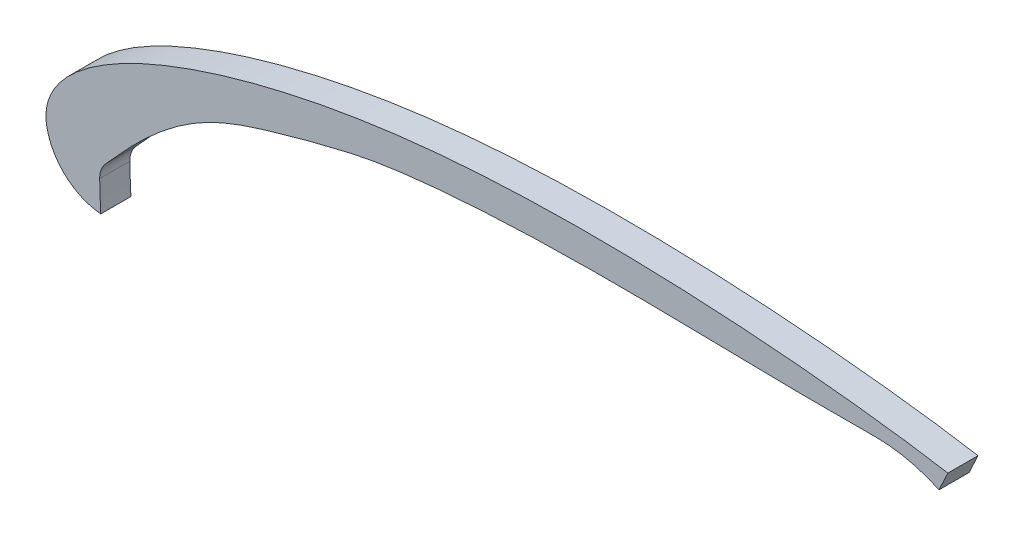
ISO-10303-21;
HEADER;
FILE_DESCRIPTION(('STEP AP214'),'2;1');
FILE_NAME('part.step','',(''),(''),'','','');
FILE_SCHEMA(('AUTOMOTIVE_DESIGN { 1 0 10303 214 1 1 1 1 }'));
ENDSEC;
DATA;
#1=APPLICATION_CONTEXT('core data for automotive mechanical design processes');
#2=APPLICATION_PROTOCOL_DEFINITION('international standard','automotive_design',2000,#1);
#3=PRODUCT_CONTEXT('',#1,'mechanical');
#4=PRODUCT('Part','Part','',(#3));
#5=PRODUCT_RELATED_PRODUCT_CATEGORY('part','',(#4));
#6=PRODUCT_DEFINITION_FORMATION('','',#4);
#7=PRODUCT_DEFINITION_CONTEXT('part definition',#1,'design');
#8=PRODUCT_DEFINITION('design','',#6,#7);
#9=PRODUCT_DEFINITION_SHAPE('','',#8);
#10=(LENGTH_UNIT() NAMED_UNIT(*) SI_UNIT(.MILLI.,.METRE.));
#11=(NAMED_UNIT(*) PLANE_ANGLE_UNIT() SI_UNIT($,.RADIAN.));
#12=(NAMED_UNIT(*) SI_UNIT($,.STERADIAN.) SOLID_ANGLE_UNIT());
#13=UNCERTAINTY_MEASURE_WITH_UNIT(LENGTH_MEASURE(1.E-05),#10,'distance_accuracy_value','');
#14=(GEOMETRIC_REPRESENTATION_CONTEXT(3) GLOBAL_UNCERTAINTY_ASSIGNED_CONTEXT((#13)) GLOBAL_UNIT_ASSIGNED_CONTEXT((#10,
#11,#12)) REPRESENTATION_CONTEXT('',''));
#15=CARTESIAN_POINT('',(0.,0.,0.));
#16=DIRECTION('',(0.,0.,1.));
#17=DIRECTION('',(1.,0.,0.));
#18=AXIS2_PLACEMENT_3D('',#15,#16,#17);
#19=CARTESIAN_POINT('',(0.,0.,1.));
#20=DIRECTION('',(0.,0.,-1.));
#21=DIRECTION('',(-1.,0.,0.));
#22=AXIS2_PLACEMENT_3D('',#19,#20,#21);
#23=CYLINDRICAL_SURFACE('',#22,9.99999999999999);
#24=CARTESIAN_POINT('',(0.,0.,-1.));
#25=DIRECTION('',(0.,0.,-1.));
#26=DIRECTION('',(1.,0.,0.));
#27=AXIS2_PLACEMENT_3D('',#24,#25,#26);
#28=CIRCLE('',#27,9.99999999999999);
#29=CARTESIAN_POINT('',(0.,9.99999999999999,-1.));
#30=VERTEX_POINT('',#29);
#31=CARTESIAN_POINT('',(4.22618261740697,9.06307787036651,-1.));
#32=VERTEX_POINT('',#31);
#33=EDGE_CURVE('E220',#30,#32,#28,.T.);
#34=ORIENTED_EDGE('',*,*,#33,.T.);
#35=DIRECTION('',(0.,0.,-1.));
#36=VECTOR('',#35,1.);
#37=CARTESIAN_POINT('',(4.22618261740697,9.06307787036651,1.));
#38=LINE('',#37,#36);
#39=CARTESIAN_POINT('',(4.22618261740697,9.06307787036651,1.));
#40=VERTEX_POINT('',#39);
#41=EDGE_CURVE('E11',#40,#32,#38,.T.);
#42=ORIENTED_EDGE('',*,*,#41,.F.);
#43=CARTESIAN_POINT('',(0.,0.,1.));
#44=DIRECTION('',(0.,0.,-1.));
#45=DIRECTION('',(1.,0.,0.));
#46=AXIS2_PLACEMENT_3D('',#43,#44,#45);
#47=CIRCLE('',#46,9.99999999999999);
#48=CARTESIAN_POINT('',(0.,9.99999999999999,1.));
#49=VERTEX_POINT('',#48);
#50=EDGE_CURVE('E237',#49,#40,#47,.T.);
#51=ORIENTED_EDGE('',*,*,#50,.F.);
#52=DIRECTION('',(0.,0.,-1.));
#53=VECTOR('',#52,1.);
#54=CARTESIAN_POINT('',(0.,9.99999999999999,1.));
#55=LINE('',#54,#53);
#56=EDGE_CURVE('E138',#49,#30,#55,.T.);
#57=ORIENTED_EDGE('',*,*,#56,.T.);
#58=EDGE_LOOP('',(#34,#42,#51,#57));
#59=FACE_BOUND('',#58,.T.);
#60=ADVANCED_FACE('F33',(#59),#23,.F.);
#61=CARTESIAN_POINT('',(4.22618261740697,9.06307787036651,1.));
#62=DIRECTION('',(-0.906307787036651,0.422618261740697,0.));
#63=DIRECTION('',(-0.422618261740697,-0.906307787036651,0.));
#64=AXIS2_PLACEMENT_3D('',#61,#62,#63);
#65=PLANE('',#64);
#66=DIRECTION('',(0.422618261740697,0.906307787036651,0.));
#67=VECTOR('',#66,1.);
#68=CARTESIAN_POINT('',(4.22618261740697,9.06307787036651,-1.));
#69=LINE('',#68,#67);
#70=CARTESIAN_POINT('',(4.81279281765103,10.3210675044314,-1.));
#71=VERTEX_POINT('',#70);
#72=EDGE_CURVE('E222',#32,#71,#69,.T.);
#73=ORIENTED_EDGE('',*,*,#72,.T.);
#74=DIRECTION('',(0.,0.,-1.));
#75=VECTOR('',#74,1.);
#76=CARTESIAN_POINT('',(4.81279281765103,10.3210675044314,1.));
#77=LINE('',#76,#75);
#78=CARTESIAN_POINT('',(4.81279281765103,10.3210675044314,1.));
#79=VERTEX_POINT('',#78);
#80=EDGE_CURVE('E44',#79,#71,#77,.T.);
#81=ORIENTED_EDGE('',*,*,#80,.F.);
#82=DIRECTION('',(0.422618261740697,0.906307787036651,0.));
#83=VECTOR('',#82,1.);
#84=CARTESIAN_POINT('',(4.22618261740697,9.06307787036651,1.));
#85=LINE('',#84,#83);
#86=EDGE_CURVE('E99',#40,#79,#85,.T.);
#87=ORIENTED_EDGE('',*,*,#86,.F.);
#88=ORIENTED_EDGE('',*,*,#41,.T.);
#89=EDGE_LOOP('',(#73,#81,#87,#88));
#90=FACE_BOUND('',#89,.T.);
#91=ADVANCED_FACE('F211',(#90),#65,.F.);
#92=CARTESIAN_POINT('',(4.81279281765103,10.3210675044314,1.));
#93=CARTESIAN_POINT('',(-0.439515198414059,11.247191118655,1.));
#94=CARTESIAN_POINT('',(-32.0979738408571,15.0809737289207,1.));
#95=CARTESIAN_POINT('',(-55.9540449768828,5.23218495978395,1.));
#96=CARTESIAN_POINT('',(-55.,0.324049042545278,1.));
#97=B_SPLINE_CURVE_WITH_KNOTS('',3,(#92,#93,#94,#95,#96),.UNSPECIFIED.,.F.,.F.,(4,1,4),(0.,
0.525665788283009,0.985260281135088),.UNSPECIFIED.);
#98=DIRECTION('',(0.,0.,-1.));
#99=VECTOR('',#98,1.);
#100=SURFACE_OF_LINEAR_EXTRUSION('',#97,#99);
#101=CARTESIAN_POINT('',(4.81279281765103,10.3210675044314,-1.));
#102=CARTESIAN_POINT('',(-0.439515198414059,11.247191118655,-1.));
#103=CARTESIAN_POINT('',(-32.0979738408571,15.0809737289207,-1.));
#104=CARTESIAN_POINT('',(-55.9540449768828,5.23218495978395,-1.));
#105=CARTESIAN_POINT('',(-55.,0.324049042545278,-1.));
#106=B_SPLINE_CURVE_WITH_KNOTS('',3,(#101,#102,#103,#104,#105),.UNSPECIFIED.,.F.,.F.,(4,1,4),
(0.,0.525665788283009,0.985260281135088),.UNSPECIFIED.);
#107=CARTESIAN_POINT('',(-55.,0.324049042545278,-1.));
#108=VERTEX_POINT('',#107);
#109=EDGE_CURVE('E223',#71,#108,#106,.T.);
#110=ORIENTED_EDGE('',*,*,#109,.T.);
#111=DIRECTION('',(0.,0.,-1.));
#112=VECTOR('',#111,1.);
#113=CARTESIAN_POINT('',(-55.,0.324049042545278,1.));
#114=LINE('',#113,#112);
#115=CARTESIAN_POINT('',(-55.,0.324049042545278,1.));
#116=VERTEX_POINT('',#115);
#117=EDGE_CURVE('E246',#116,#108,#114,.T.);
#118=ORIENTED_EDGE('',*,*,#117,.F.);
#119=EDGE_CURVE('E254',#79,#116,#97,.T.);
#120=ORIENTED_EDGE('',*,*,#119,.F.);
#121=ORIENTED_EDGE('',*,*,#80,.T.);
#122=EDGE_LOOP('',(#110,#118,#120,#121));
#123=FACE_BOUND('',#122,.T.);
#124=ADVANCED_FACE('F216',(#123),#100,.F.);
#125=CARTESIAN_POINT('',(-51.0734912662093,1.08728502405143,1.));
#126=DIRECTION('',(0.,0.,-1.));
#127=DIRECTION('',(-1.,0.,0.));
#128=AXIS2_PLACEMENT_3D('',#125,#126,#127);
#129=CYLINDRICAL_SURFACE('',#128,4.);
#130=CARTESIAN_POINT('',(-51.0734912662093,1.08728502405143,-1.));
#131=DIRECTION('',(0.,0.,1.));
#132=DIRECTION('',(1.,0.,0.));
#133=AXIS2_PLACEMENT_3D('',#130,#131,#132);
#134=CIRCLE('',#133,4.);
#135=CARTESIAN_POINT('',(-51.4184077998879,-2.89781630274004,-1.));
#136=VERTEX_POINT('',#135);
#137=EDGE_CURVE('E229',#108,#136,#134,.T.);
#138=ORIENTED_EDGE('',*,*,#137,.T.);
#139=DIRECTION('',(0.,0.,-1.));
#140=VECTOR('',#139,1.);
#141=CARTESIAN_POINT('',(-51.4184077998879,-2.89781630274004,1.));
#142=LINE('',#141,#140);
#143=CARTESIAN_POINT('',(-51.4184077998879,-2.89781630274004,1.));
#144=VERTEX_POINT('',#143);
#145=EDGE_CURVE('E243',#144,#136,#142,.T.);
#146=ORIENTED_EDGE('',*,*,#145,.F.);
#147=CARTESIAN_POINT('',(-51.0734912662093,1.08728502405143,1.));
#148=DIRECTION('',(0.,0.,1.));
#149=DIRECTION('',(1.,0.,0.));
#150=AXIS2_PLACEMENT_3D('',#147,#148,#149);
#151=CIRCLE('',#150,4.);
#152=EDGE_CURVE('E266',#116,#144,#151,.T.);
#153=ORIENTED_EDGE('',*,*,#152,.F.);
#154=ORIENTED_EDGE('',*,*,#117,.T.);
#155=EDGE_LOOP('',(#138,#146,#153,#154));
#156=FACE_BOUND('',#155,.T.);
#157=ADVANCED_FACE('F259',(#156),#129,.T.);
#158=CARTESIAN_POINT('',(0.,0.,1.));
#159=DIRECTION('',(0.,0.,-1.));
#160=DIRECTION('',(-1.,0.,0.));
#161=AXIS2_PLACEMENT_3D('',#158,#159,#160);
#162=CYLINDRICAL_SURFACE('',#161,51.5);
#163=CARTESIAN_POINT('',(0.,0.,-1.));
#164=DIRECTION('',(0.,0.,-1.));
#165=DIRECTION('',(1.,0.,0.));
#166=AXIS2_PLACEMENT_3D('',#163,#164,#165);
#167=CIRCLE('',#166,51.5);
#168=CARTESIAN_POINT('',(-51.4921563005542,-0.898798931519692,-1.));
#169=VERTEX_POINT('',#168);
#170=EDGE_CURVE('E234',#136,#169,#167,.T.);
#171=ORIENTED_EDGE('',*,*,#170,.T.);
#172=DIRECTION('',(0.,0.,-1.));
#173=VECTOR('',#172,1.);
#174=CARTESIAN_POINT('',(-51.4921563005542,-0.898798931519692,1.));
#175=LINE('',#174,#173);
#176=CARTESIAN_POINT('',(-51.4921563005542,-0.898798931519692,1.));
#177=VERTEX_POINT('',#176);
#178=EDGE_CURVE('E240',#177,#169,#175,.T.);
#179=ORIENTED_EDGE('',*,*,#178,.F.);
#180=CARTESIAN_POINT('',(0.,0.,1.));
#181=DIRECTION('',(0.,0.,-1.));
#182=DIRECTION('',(1.,0.,0.));
#183=AXIS2_PLACEMENT_3D('',#180,#181,#182);
#184=CIRCLE('',#183,51.5);
#185=EDGE_CURVE('E265',#144,#177,#184,.T.);
#186=ORIENTED_EDGE('',*,*,#185,.F.);
#187=ORIENTED_EDGE('',*,*,#145,.T.);
#188=EDGE_LOOP('',(#171,#179,#186,#187));
#189=FACE_BOUND('',#188,.T.);
#190=ADVANCED_FACE('F263',(#189),#162,.F.);
#191=CARTESIAN_POINT('',(-49.9923847578196,-0.872620321863798,1.));
#192=DIRECTION('',(0.,0.,-1.));
#193=DIRECTION('',(-1.,0.,0.));
#194=AXIS2_PLACEMENT_3D('',#191,#192,#193);
#195=CYLINDRICAL_SURFACE('',#194,1.5);
#196=CARTESIAN_POINT('',(-49.9923847578196,-0.872620321863798,-1.));
#197=DIRECTION('',(0.,0.,-1.));
#198=DIRECTION('',(1.,0.,0.));
#199=AXIS2_PLACEMENT_3D('',#196,#197,#198);
#200=CIRCLE('',#199,1.5);
#201=CARTESIAN_POINT('',(-51.0713944583275,0.16936723382471,-1.));
#202=VERTEX_POINT('',#201);
#203=EDGE_CURVE('E187',#169,#202,#200,.T.);
#204=ORIENTED_EDGE('',*,*,#203,.T.);
#205=DIRECTION('',(0.,0.,-1.));
#206=VECTOR('',#205,1.);
#207=CARTESIAN_POINT('',(-51.0713944583275,0.16936723382471,1.));
#208=LINE('',#207,#206);
#209=CARTESIAN_POINT('',(-51.0713944583275,0.16936723382471,1.));
#210=VERTEX_POINT('',#209);
#211=EDGE_CURVE('E133',#210,#202,#208,.T.);
#212=ORIENTED_EDGE('',*,*,#211,.F.);
#213=CARTESIAN_POINT('',(-49.9923847578196,-0.872620321863798,1.));
#214=DIRECTION('',(0.,0.,-1.));
#215=DIRECTION('',(1.,0.,0.));
#216=AXIS2_PLACEMENT_3D('',#213,#214,#215);
#217=CIRCLE('',#216,1.5);
#218=EDGE_CURVE('E122',#177,#210,#217,.T.);
#219=ORIENTED_EDGE('',*,*,#218,.F.);
#220=ORIENTED_EDGE('',*,*,#178,.T.);
#221=EDGE_LOOP('',(#204,#212,#219,#220));
#222=FACE_BOUND('',#221,.T.);
#223=ADVANCED_FACE('F166',(#222),#195,.F.);
#224=CARTESIAN_POINT('',(-51.0713944583275,0.169367233824712,1.));
#225=CARTESIAN_POINT('',(-50.9805982529573,0.263389456862719,1.));
#226=CARTESIAN_POINT('',(-50.8647657774469,0.389195099872988,1.));
#227=CARTESIAN_POINT('',(-50.5972528534315,0.684916496976077,1.));
#228=CARTESIAN_POINT('',(-50.4451063419981,0.855114539113282,1.));
#229=CARTESIAN_POINT('',(-49.9396920582591,1.41472922458248,1.));
#230=CARTESIAN_POINT('',(-49.5376012833696,1.85298139805016,1.));
#231=CARTESIAN_POINT('',(-48.1451975928643,3.25581141325291,1.));
#232=CARTESIAN_POINT('',(-46.9686202163316,4.3108815125776,1.));
#233=CARTESIAN_POINT('',(-45.1657129338055,5.45361650397881,1.));
#234=CARTESIAN_POINT('',(-44.788441649216,5.67326916665092,1.));
#235=CARTESIAN_POINT('',(-44.0000076166153,6.08601760932638,1.));
#236=CARTESIAN_POINT('',(-43.5873016645333,6.27807391168558,1.));
#237=CARTESIAN_POINT('',(-42.3421939929647,6.79878833875617,1.));
#238=CARTESIAN_POINT('',(-41.4921532347602,7.08226066023785,1.));
#239=CARTESIAN_POINT('',(-40.2364638488284,7.46628864979926,1.));
#240=CARTESIAN_POINT('',(-39.8232638452312,7.58714968387671,1.));
#241=CARTESIAN_POINT('',(-38.9977959564146,7.82376911765903,1.));
#242=CARTESIAN_POINT('',(-38.585610163683,7.93877428357867,1.));
#243=CARTESIAN_POINT('',(-37.35004176191,8.27392501354951,1.));
#244=CARTESIAN_POINT('',(-36.5276470017244,8.48420536081841,1.));
#245=CARTESIAN_POINT('',(-32.4135947176749,9.47051042671179,1.));
#246=CARTESIAN_POINT('',(-29.1156206468005,10.0509607318468,1.));
#247=CARTESIAN_POINT('',(-22.2874700313958,10.815604214411,1.));
#248=CARTESIAN_POINT('',(-18.7576756142058,10.9999238359781,1.));
#249=CARTESIAN_POINT('',(-15.,10.9999238359781,1.));
#250=B_SPLINE_CURVE_WITH_KNOTS('',3,(#224,#225,#226,#227,#228,#229,#230,#231,#232,#233,#234,
#235,#236,#237,#238,#239,#240,#241,#242,#243,#244,#245,#246,#247,#248,#249),.UNSPECIFIED.,.F.,
.F.,(4,2,2,2,2,2,2,2,2,2,2,2,4),(0.,0.0312500000000002,0.0625000000000003,0.125,0.25,0.28125,
0.3125,0.375,0.40625,0.4375,0.5,0.75,1.),.UNSPECIFIED.);
#251=DIRECTION('',(0.,0.,-1.));
#252=VECTOR('',#251,1.);
#253=SURFACE_OF_LINEAR_EXTRUSION('',#250,#252);
#254=CARTESIAN_POINT('',(-51.0713944583275,0.169367233824712,-1.));
#255=CARTESIAN_POINT('',(-50.9805982529573,0.263389456862719,-1.));
#256=CARTESIAN_POINT('',(-50.8647657774469,0.389195099872988,-1.));
#257=CARTESIAN_POINT('',(-50.5972528534315,0.684916496976077,-1.));
#258=CARTESIAN_POINT('',(-50.4451063419981,0.855114539113282,-1.));
#259=CARTESIAN_POINT('',(-49.9396920582591,1.41472922458248,-1.));
#260=CARTESIAN_POINT('',(-49.5376012833696,1.85298139805016,-1.));
#261=CARTESIAN_POINT('',(-48.1451975928643,3.25581141325291,-1.));
#262=CARTESIAN_POINT('',(-46.9686202163316,4.3108815125776,-1.));
#263=CARTESIAN_POINT('',(-45.1657129338055,5.45361650397881,-1.));
#264=CARTESIAN_POINT('',(-44.788441649216,5.67326916665092,-1.));
#265=CARTESIAN_POINT('',(-44.0000076166153,6.08601760932638,-1.));
#266=CARTESIAN_POINT('',(-43.5873016645333,6.27807391168558,-1.));
#267=CARTESIAN_POINT('',(-42.3421939929647,6.79878833875617,-1.));
#268=CARTESIAN_POINT('',(-41.4921532347602,7.08226066023785,-1.));
#269=CARTESIAN_POINT('',(-40.2364638488284,7.46628864979926,-1.));
#270=CARTESIAN_POINT('',(-39.8232638452312,7.58714968387671,-1.));
#271=CARTESIAN_POINT('',(-38.9977959564146,7.82376911765903,-1.));
#272=CARTESIAN_POINT('',(-38.585610163683,7.93877428357867,-1.));
#273=CARTESIAN_POINT('',(-37.35004176191,8.27392501354951,-1.));
#274=CARTESIAN_POINT('',(-36.5276470017244,8.48420536081841,-1.));
#275=CARTESIAN_POINT('',(-35.4018473989431,8.75410515176396,-1.));
#276=CARTESIAN_POINT('',(-35.0988011978837,8.82497611849276,-1.));
#277=CARTESIAN_POINT('',(-34.7956126128562,8.89408743904247,-1.));
#278=B_SPLINE_CURVE_WITH_KNOTS('',3,(#254,#255,#256,#257,#258,#259,#260,#261,#262,#263,#264,
#265,#266,#267,#268,#269,#270,#271,#272,#273,#274,#275,#276,#277),.UNSPECIFIED.,.F.,.F.,(4,2,2,
2,2,2,2,2,2,2,2,4),(0.,0.0312500000000002,0.0625000000000003,0.125,0.25,0.28125,0.3125,0.375,
0.40625,0.4375,0.5,0.523014804280243),.UNSPECIFIED.);
#279=CARTESIAN_POINT('',(-34.7956126128562,8.89408743904247,-1.));
#280=VERTEX_POINT('',#279);
#281=EDGE_CURVE('E131',#202,#280,#278,.T.);
#282=ORIENTED_EDGE('',*,*,#281,.T.);
#283=DIRECTION('',(0.,0.,-1.));
#284=VECTOR('',#283,1.);
#285=CARTESIAN_POINT('',(-34.7956126128562,8.89408743904247,1.));
#286=LINE('',#285,#284);
#287=CARTESIAN_POINT('',(-34.7956126128562,8.89408743904247,1.));
#288=VERTEX_POINT('',#287);
#289=EDGE_CURVE('E128',#288,#280,#286,.T.);
#290=ORIENTED_EDGE('',*,*,#289,.F.);
#291=CARTESIAN_POINT('',(-34.7956126128562,8.89408743904247,1.));
#292=CARTESIAN_POINT('',(-35.0988011978837,8.82497611849276,1.));
#293=CARTESIAN_POINT('',(-35.4018473989431,8.75410515176396,1.));
#294=CARTESIAN_POINT('',(-36.5276470017244,8.48420536081841,1.));
#295=CARTESIAN_POINT('',(-37.35004176191,8.27392501354951,1.));
#296=CARTESIAN_POINT('',(-38.585610163683,7.93877428357867,1.));
#297=CARTESIAN_POINT('',(-38.9977959564146,7.82376911765903,1.));
#298=CARTESIAN_POINT('',(-39.8232638452312,7.58714968387671,1.));
#299=CARTESIAN_POINT('',(-40.2364638488284,7.46628864979926,1.));
#300=CARTESIAN_POINT('',(-41.4921532347602,7.08226066023785,1.));
#301=CARTESIAN_POINT('',(-42.3421939929647,6.79878833875617,1.));
#302=CARTESIAN_POINT('',(-43.5873016645333,6.27807391168558,1.));
#303=CARTESIAN_POINT('',(-44.0000076166153,6.08601760932638,1.));
#304=CARTESIAN_POINT('',(-44.788441649216,5.67326916665092,1.));
#305=CARTESIAN_POINT('',(-45.1657129338055,5.45361650397881,1.));
#306=CARTESIAN_POINT('',(-46.9686202163316,4.3108815125776,1.));
#307=CARTESIAN_POINT('',(-48.1451975928643,3.25581141325291,1.));
#308=CARTESIAN_POINT('',(-49.5376012833696,1.85298139805016,1.));
#309=CARTESIAN_POINT('',(-49.9396920582591,1.41472922458248,1.));
#310=CARTESIAN_POINT('',(-50.4451063419981,0.855114539113282,1.));
#311=CARTESIAN_POINT('',(-50.5972528534315,0.684916496976077,1.));
#312=CARTESIAN_POINT('',(-50.8647657774469,0.389195099872988,1.));
#313=CARTESIAN_POINT('',(-50.9805982529573,0.263389456862719,1.));
#314=CARTESIAN_POINT('',(-51.0713944583275,0.169367233824712,1.));
#315=B_SPLINE_CURVE_WITH_KNOTS('',3,(#291,#292,#293,#294,#295,#296,#297,#298,#299,#300,#301,
#302,#303,#304,#305,#306,#307,#308,#309,#310,#311,#312,#313,#314),.UNSPECIFIED.,.F.,.F.,(4,2,2,
2,2,2,2,2,2,2,2,4),(0.,0.0230148042802428,0.0855148042802427,0.116764804280243,
0.148014804280243,0.210514804280243,0.241764804280243,0.273014804280243,0.398014804280243,
0.460514804280243,0.491764804280243,0.523014804280243),.UNSPECIFIED.);
#316=EDGE_CURVE('E115',#210,#288,#315,.F.);
#317=ORIENTED_EDGE('',*,*,#316,.F.);
#318=ORIENTED_EDGE('',*,*,#211,.T.);
#319=EDGE_LOOP('',(#282,#290,#317,#318));
#320=FACE_BOUND('',#319,.T.);
#321=ADVANCED_FACE('F129',(#320),#253,.F.);
#322=CARTESIAN_POINT('',(-34.7956126128539,8.89408743904299,1.));
#323=CARTESIAN_POINT('',(-31.5456449149779,9.63491202953258,1.));
#324=CARTESIAN_POINT('',(-20.4831240034218,10.4805510782093,1.));
#325=CARTESIAN_POINT('',(-8.33333333333334,10.,1.));
#326=CARTESIAN_POINT('',(-5.,10.,1.));
#327=B_SPLINE_CURVE_WITH_KNOTS('',3,(#322,#323,#324,#325,#326),.UNSPECIFIED.,.F.,.F.,(4,1,4),
(0.,0.46596837602931,1.),.UNSPECIFIED.);
#328=DIRECTION('',(0.,0.,-1.));
#329=VECTOR('',#328,1.);
#330=SURFACE_OF_LINEAR_EXTRUSION('',#327,#329);
#331=CARTESIAN_POINT('',(-34.7956126128539,8.89408743904299,-1.));
#332=CARTESIAN_POINT('',(-31.5456449149779,9.63491202953258,-1.));
#333=CARTESIAN_POINT('',(-20.4831240034218,10.4805510782093,-1.));
#334=CARTESIAN_POINT('',(-8.33333333333334,10.,-1.));
#335=CARTESIAN_POINT('',(-5.,10.,-1.));
#336=B_SPLINE_CURVE_WITH_KNOTS('',3,(#331,#332,#333,#334,#335),.UNSPECIFIED.,.F.,.F.,(4,1,4),
(0.,0.46596837602931,1.),.UNSPECIFIED.);
#337=CARTESIAN_POINT('',(-5.,10.,-1.));
#338=VERTEX_POINT('',#337);
#339=EDGE_CURVE('E85',#280,#338,#336,.T.);
#340=ORIENTED_EDGE('',*,*,#339,.T.);
#341=DIRECTION('',(0.,0.,-1.));
#342=VECTOR('',#341,1.);
#343=CARTESIAN_POINT('',(-5.,10.,1.));
#344=LINE('',#343,#342);
#345=CARTESIAN_POINT('',(-5.,10.,1.));
#346=VERTEX_POINT('',#345);
#347=EDGE_CURVE('E134',#346,#338,#344,.T.);
#348=ORIENTED_EDGE('',*,*,#347,.F.);
#349=EDGE_CURVE('E120',#288,#346,#327,.T.);
#350=ORIENTED_EDGE('',*,*,#349,.F.);
#351=ORIENTED_EDGE('',*,*,#289,.T.);
#352=EDGE_LOOP('',(#340,#348,#350,#351));
#353=FACE_BOUND('',#352,.T.);
#354=ADVANCED_FACE('F136',(#353),#330,.F.);
#355=CARTESIAN_POINT('',(0.,9.99999999999999,1.));
#356=DIRECTION('',(0.,1.,0.));
#357=DIRECTION('',(-1.,0.,0.));
#358=AXIS2_PLACEMENT_3D('',#355,#356,#357);
#359=PLANE('',#358);
#360=DIRECTION('',(1.,0.,0.));
#361=VECTOR('',#360,1.);
#362=CARTESIAN_POINT('',(0.,9.99999999999999,-1.));
#363=LINE('',#362,#361);
#364=EDGE_CURVE('E91',#338,#30,#363,.T.);
#365=ORIENTED_EDGE('',*,*,#364,.T.);
#366=ORIENTED_EDGE('',*,*,#56,.F.);
#367=DIRECTION('',(1.,0.,0.));
#368=VECTOR('',#367,1.);
#369=CARTESIAN_POINT('',(0.,9.99999999999999,1.));
#370=LINE('',#369,#368);
#371=EDGE_CURVE('E53',#346,#49,#370,.T.);
#372=ORIENTED_EDGE('',*,*,#371,.F.);
#373=ORIENTED_EDGE('',*,*,#347,.T.);
#374=EDGE_LOOP('',(#365,#366,#372,#373));
#375=FACE_BOUND('',#374,.T.);
#376=ADVANCED_FACE('F161',(#375),#359,.F.);
#377=CARTESIAN_POINT('',(0.,0.,1.));
#378=DIRECTION('',(0.,0.,1.));
#379=DIRECTION('',(1.,0.,0.));
#380=AXIS2_PLACEMENT_3D('',#377,#378,#379);
#381=PLANE('',#380);
#382=ORIENTED_EDGE('',*,*,#50,.T.);
#383=ORIENTED_EDGE('',*,*,#86,.T.);
#384=ORIENTED_EDGE('',*,*,#119,.T.);
#385=ORIENTED_EDGE('',*,*,#152,.T.);
#386=ORIENTED_EDGE('',*,*,#185,.T.);
#387=ORIENTED_EDGE('',*,*,#218,.T.);
#388=ORIENTED_EDGE('',*,*,#316,.T.);
#389=ORIENTED_EDGE('',*,*,#349,.T.);
#390=ORIENTED_EDGE('',*,*,#371,.T.);
#391=EDGE_LOOP('',(#382,#383,#384,#385,#386,#387,#388,#389,#390));
#392=FACE_BOUND('',#391,.T.);
#393=ADVANCED_FACE('F118',(#392),#381,.T.);
#394=CARTESIAN_POINT('',(0.,0.,-1.));
#395=DIRECTION('',(0.,0.,1.));
#396=DIRECTION('',(1.,0.,0.));
#397=AXIS2_PLACEMENT_3D('',#394,#395,#396);
#398=PLANE('',#397);
#399=ORIENTED_EDGE('',*,*,#33,.F.);
#400=ORIENTED_EDGE('',*,*,#364,.F.);
#401=ORIENTED_EDGE('',*,*,#339,.F.);
#402=ORIENTED_EDGE('',*,*,#281,.F.);
#403=ORIENTED_EDGE('',*,*,#203,.F.);
#404=ORIENTED_EDGE('',*,*,#170,.F.);
#405=ORIENTED_EDGE('',*,*,#137,.F.);
#406=ORIENTED_EDGE('',*,*,#109,.F.);
#407=ORIENTED_EDGE('',*,*,#72,.F.);
#408=EDGE_LOOP('',(#399,#400,#401,#402,#403,#404,#405,#406,#407));
#409=FACE_BOUND('',#408,.T.);
#410=ADVANCED_FACE('F189',(#409),#398,.F.);
#411=CLOSED_SHELL('',(#60,#91,#124,#157,#190,#223,#321,#354,#376,#393,#410));
#412=MANIFOLD_SOLID_BREP('B2',#411);
#413=ADVANCED_BREP_SHAPE_REPRESENTATION('',(#18,#412),#14);
#414=SHAPE_DEFINITION_REPRESENTATION(#9,#413);
ENDSEC;
END-ISO-10303-21;
